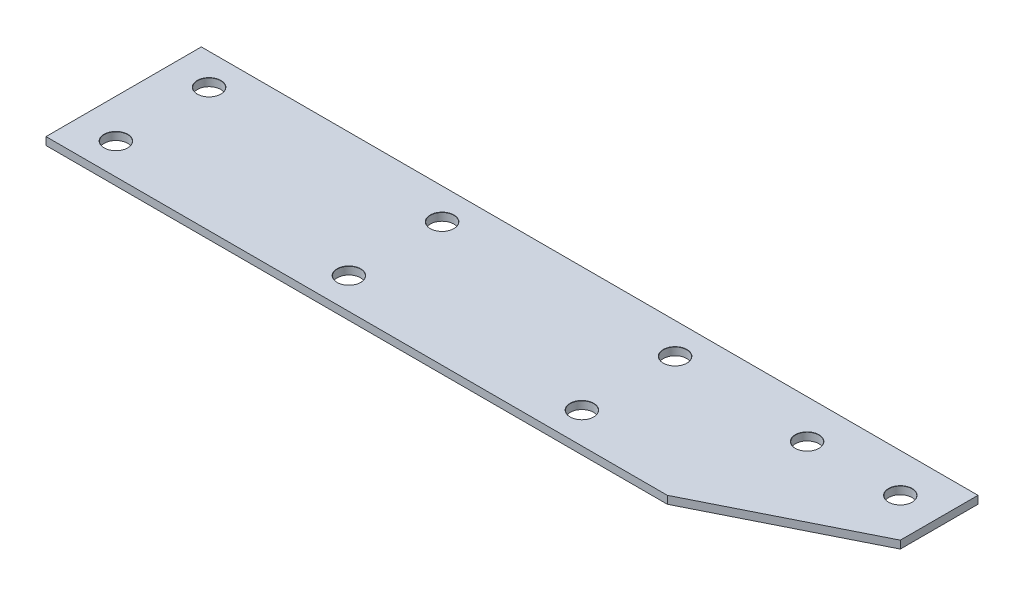
ISO-10303-21;
HEADER;
FILE_DESCRIPTION(('STEP AP214'),'2;1');
FILE_NAME('part.step','',(''),(''),'','','');
FILE_SCHEMA(('AUTOMOTIVE_DESIGN { 1 0 10303 214 1 1 1 1 }'));
ENDSEC;
DATA;
#1=APPLICATION_CONTEXT('core data for automotive mechanical design processes');
#2=APPLICATION_PROTOCOL_DEFINITION('international standard','automotive_design',2000,#1);
#3=PRODUCT_CONTEXT('',#1,'mechanical');
#4=PRODUCT('Part','Part','',(#3));
#5=PRODUCT_RELATED_PRODUCT_CATEGORY('part','',(#4));
#6=PRODUCT_DEFINITION_FORMATION('','',#4);
#7=PRODUCT_DEFINITION_CONTEXT('part definition',#1,'design');
#8=PRODUCT_DEFINITION('design','',#6,#7);
#9=PRODUCT_DEFINITION_SHAPE('','',#8);
#10=(LENGTH_UNIT() NAMED_UNIT(*) SI_UNIT(.MILLI.,.METRE.));
#11=(NAMED_UNIT(*) PLANE_ANGLE_UNIT() SI_UNIT($,.RADIAN.));
#12=(NAMED_UNIT(*) SI_UNIT($,.STERADIAN.) SOLID_ANGLE_UNIT());
#13=UNCERTAINTY_MEASURE_WITH_UNIT(LENGTH_MEASURE(1.E-05),#10,'distance_accuracy_value','');
#14=(GEOMETRIC_REPRESENTATION_CONTEXT(3) GLOBAL_UNCERTAINTY_ASSIGNED_CONTEXT((#13)) GLOBAL_UNIT_ASSIGNED_CONTEXT((#10,
#11,#12)) REPRESENTATION_CONTEXT('',''));
#15=CARTESIAN_POINT('',(0.,0.,0.));
#16=DIRECTION('',(0.,0.,1.));
#17=DIRECTION('',(1.,0.,0.));
#18=AXIS2_PLACEMENT_3D('',#15,#16,#17);
#19=CARTESIAN_POINT('',(0.,1.,0.));
#20=DIRECTION('',(-1.,0.,0.));
#21=DIRECTION('',(0.,0.,1.));
#22=AXIS2_PLACEMENT_3D('',#19,#20,#21);
#23=PLANE('',#22);
#24=DIRECTION('',(0.,0.,-1.));
#25=VECTOR('',#24,1.);
#26=CARTESIAN_POINT('',(0.,0.,0.));
#27=LINE('',#26,#25);
#28=CARTESIAN_POINT('',(0.,0.,0.));
#29=VERTEX_POINT('',#28);
#30=CARTESIAN_POINT('',(0.,0.,-20.));
#31=VERTEX_POINT('',#30);
#32=EDGE_CURVE('E132',#29,#31,#27,.T.);
#33=ORIENTED_EDGE('',*,*,#32,.F.);
#34=DIRECTION('',(0.,-1.,0.));
#35=VECTOR('',#34,1.);
#36=CARTESIAN_POINT('',(0.,1.,0.));
#37=LINE('',#36,#35);
#38=CARTESIAN_POINT('',(0.,1.,0.));
#39=VERTEX_POINT('',#38);
#40=EDGE_CURVE('E13',#39,#29,#37,.T.);
#41=ORIENTED_EDGE('',*,*,#40,.F.);
#42=DIRECTION('',(0.,0.,-1.));
#43=VECTOR('',#42,1.);
#44=CARTESIAN_POINT('',(0.,1.,0.));
#45=LINE('',#44,#43);
#46=CARTESIAN_POINT('',(0.,1.,-20.));
#47=VERTEX_POINT('',#46);
#48=EDGE_CURVE('E148',#39,#47,#45,.T.);
#49=ORIENTED_EDGE('',*,*,#48,.T.);
#50=DIRECTION('',(0.,-1.,0.));
#51=VECTOR('',#50,1.);
#52=CARTESIAN_POINT('',(0.,1.,-20.));
#53=LINE('',#52,#51);
#54=EDGE_CURVE('E53',#47,#31,#53,.T.);
#55=ORIENTED_EDGE('',*,*,#54,.T.);
#56=EDGE_LOOP('',(#33,#41,#49,#55));
#57=FACE_BOUND('',#56,.T.);
#58=ADVANCED_FACE('F50',(#57),#23,.T.);
#59=CARTESIAN_POINT('',(0.,1.,0.));
#60=DIRECTION('',(0.,0.,-1.));
#61=DIRECTION('',(-1.,0.,0.));
#62=AXIS2_PLACEMENT_3D('',#59,#60,#61);
#63=PLANE('',#62);
#64=DIRECTION('',(1.,0.,0.));
#65=VECTOR('',#64,1.);
#66=CARTESIAN_POINT('',(0.,0.,0.));
#67=LINE('',#66,#65);
#68=CARTESIAN_POINT('',(80.,0.,0.));
#69=VERTEX_POINT('',#68);
#70=EDGE_CURVE('E146',#29,#69,#67,.T.);
#71=ORIENTED_EDGE('',*,*,#70,.T.);
#72=DIRECTION('',(0.,-1.,0.));
#73=VECTOR('',#72,1.);
#74=CARTESIAN_POINT('',(80.,1.,0.));
#75=LINE('',#74,#73);
#76=CARTESIAN_POINT('',(80.,1.,0.));
#77=VERTEX_POINT('',#76);
#78=EDGE_CURVE('E60',#77,#69,#75,.T.);
#79=ORIENTED_EDGE('',*,*,#78,.F.);
#80=DIRECTION('',(1.,0.,0.));
#81=VECTOR('',#80,1.);
#82=CARTESIAN_POINT('',(0.,1.,0.));
#83=LINE('',#82,#81);
#84=EDGE_CURVE('E124',#39,#77,#83,.T.);
#85=ORIENTED_EDGE('',*,*,#84,.F.);
#86=ORIENTED_EDGE('',*,*,#40,.T.);
#87=EDGE_LOOP('',(#71,#79,#85,#86));
#88=FACE_BOUND('',#87,.T.);
#89=ADVANCED_FACE('F158',(#88),#63,.F.);
#90=CARTESIAN_POINT('',(100.,1.,-10.));
#91=DIRECTION('',(0.447213595499958,0.,0.894427190999916));
#92=DIRECTION('',(0.894427190999916,0.,-0.447213595499958));
#93=AXIS2_PLACEMENT_3D('',#90,#91,#92);
#94=PLANE('',#93);
#95=DIRECTION('',(-0.894427190999916,0.,0.447213595499958));
#96=VECTOR('',#95,1.);
#97=CARTESIAN_POINT('',(100.,0.,-10.));
#98=LINE('',#97,#96);
#99=CARTESIAN_POINT('',(100.,0.,-10.));
#100=VERTEX_POINT('',#99);
#101=EDGE_CURVE('E108',#100,#69,#98,.T.);
#102=ORIENTED_EDGE('',*,*,#101,.F.);
#103=DIRECTION('',(0.,-1.,0.));
#104=VECTOR('',#103,1.);
#105=CARTESIAN_POINT('',(100.,1.,-10.));
#106=LINE('',#105,#104);
#107=CARTESIAN_POINT('',(100.,1.,-10.));
#108=VERTEX_POINT('',#107);
#109=EDGE_CURVE('E102',#108,#100,#106,.T.);
#110=ORIENTED_EDGE('',*,*,#109,.F.);
#111=DIRECTION('',(-0.894427190999916,0.,0.447213595499958));
#112=VECTOR('',#111,1.);
#113=CARTESIAN_POINT('',(100.,1.,-10.));
#114=LINE('',#113,#112);
#115=EDGE_CURVE('E106',#108,#77,#114,.T.);
#116=ORIENTED_EDGE('',*,*,#115,.T.);
#117=ORIENTED_EDGE('',*,*,#78,.T.);
#118=EDGE_LOOP('',(#102,#110,#116,#117));
#119=FACE_BOUND('',#118,.T.);
#120=ADVANCED_FACE('F104',(#119),#94,.T.);
#121=CARTESIAN_POINT('',(100.,1.,-10.));
#122=DIRECTION('',(-1.,0.,0.));
#123=DIRECTION('',(0.,0.,1.));
#124=AXIS2_PLACEMENT_3D('',#121,#122,#123);
#125=PLANE('',#124);
#126=DIRECTION('',(0.,0.,-1.));
#127=VECTOR('',#126,1.);
#128=CARTESIAN_POINT('',(100.,0.,-10.));
#129=LINE('',#128,#127);
#130=CARTESIAN_POINT('',(100.,0.,-20.));
#131=VERTEX_POINT('',#130);
#132=EDGE_CURVE('E141',#100,#131,#129,.T.);
#133=ORIENTED_EDGE('',*,*,#132,.T.);
#134=DIRECTION('',(0.,-1.,0.));
#135=VECTOR('',#134,1.);
#136=CARTESIAN_POINT('',(100.,1.,-20.));
#137=LINE('',#136,#135);
#138=CARTESIAN_POINT('',(100.,1.,-20.));
#139=VERTEX_POINT('',#138);
#140=EDGE_CURVE('E113',#139,#131,#137,.T.);
#141=ORIENTED_EDGE('',*,*,#140,.F.);
#142=DIRECTION('',(0.,0.,-1.));
#143=VECTOR('',#142,1.);
#144=CARTESIAN_POINT('',(100.,1.,-10.));
#145=LINE('',#144,#143);
#146=EDGE_CURVE('E116',#108,#139,#145,.T.);
#147=ORIENTED_EDGE('',*,*,#146,.F.);
#148=ORIENTED_EDGE('',*,*,#109,.T.);
#149=EDGE_LOOP('',(#133,#141,#147,#148));
#150=FACE_BOUND('',#149,.T.);
#151=ADVANCED_FACE('F117',(#150),#125,.F.);
#152=CARTESIAN_POINT('',(0.,1.,-20.));
#153=DIRECTION('',(0.,0.,-1.));
#154=DIRECTION('',(-1.,0.,0.));
#155=AXIS2_PLACEMENT_3D('',#152,#153,#154);
#156=PLANE('',#155);
#157=DIRECTION('',(1.,0.,0.));
#158=VECTOR('',#157,1.);
#159=CARTESIAN_POINT('',(0.,0.,-20.));
#160=LINE('',#159,#158);
#161=EDGE_CURVE('E136',#31,#131,#160,.T.);
#162=ORIENTED_EDGE('',*,*,#161,.F.);
#163=ORIENTED_EDGE('',*,*,#54,.F.);
#164=DIRECTION('',(1.,0.,0.));
#165=VECTOR('',#164,1.);
#166=CARTESIAN_POINT('',(0.,1.,-20.));
#167=LINE('',#166,#165);
#168=EDGE_CURVE('E120',#47,#139,#167,.T.);
#169=ORIENTED_EDGE('',*,*,#168,.T.);
#170=ORIENTED_EDGE('',*,*,#140,.T.);
#171=EDGE_LOOP('',(#162,#163,#169,#170));
#172=FACE_BOUND('',#171,.T.);
#173=ADVANCED_FACE('F155',(#172),#156,.T.);
#174=CARTESIAN_POINT('',(0.,1.,0.));
#175=DIRECTION('',(0.,-1.,0.));
#176=DIRECTION('',(0.,0.,-1.));
#177=AXIS2_PLACEMENT_3D('',#174,#175,#176);
#178=PLANE('',#177);
#179=CARTESIAN_POINT('',(5.,1.,-16.));
#180=DIRECTION('',(0.,1.,0.));
#181=DIRECTION('',(0.,0.,1.));
#182=AXIS2_PLACEMENT_3D('',#179,#180,#181);
#183=CIRCLE('',#182,1.525);
#184=CARTESIAN_POINT('',(5.,1.,-14.475));
#185=VERTEX_POINT('',#184);
#186=EDGE_CURVE('E255',#185,#185,#183,.T.);
#187=ORIENTED_EDGE('',*,*,#186,.F.);
#188=EDGE_LOOP('',(#187));
#189=FACE_BOUND('',#188,.T.);
#190=CARTESIAN_POINT('',(5.,1.,-4.));
#191=DIRECTION('',(0.,1.,0.));
#192=DIRECTION('',(0.,0.,1.));
#193=AXIS2_PLACEMENT_3D('',#190,#191,#192);
#194=CIRCLE('',#193,1.525);
#195=CARTESIAN_POINT('',(5.,1.,-2.475));
#196=VERTEX_POINT('',#195);
#197=EDGE_CURVE('E243',#196,#196,#194,.T.);
#198=ORIENTED_EDGE('',*,*,#197,.F.);
#199=EDGE_LOOP('',(#198));
#200=FACE_BOUND('',#199,.T.);
#201=CARTESIAN_POINT('',(35.,1.,-16.));
#202=DIRECTION('',(0.,1.,0.));
#203=DIRECTION('',(0.,0.,1.));
#204=AXIS2_PLACEMENT_3D('',#201,#202,#203);
#205=CIRCLE('',#204,1.525);
#206=CARTESIAN_POINT('',(35.,1.,-14.475));
#207=VERTEX_POINT('',#206);
#208=EDGE_CURVE('E231',#207,#207,#205,.T.);
#209=ORIENTED_EDGE('',*,*,#208,.F.);
#210=EDGE_LOOP('',(#209));
#211=FACE_BOUND('',#210,.T.);
#212=CARTESIAN_POINT('',(65.,1.,-16.));
#213=DIRECTION('',(0.,1.,0.));
#214=DIRECTION('',(0.,0.,1.));
#215=AXIS2_PLACEMENT_3D('',#212,#213,#214);
#216=CIRCLE('',#215,1.525);
#217=CARTESIAN_POINT('',(65.,1.,-14.475));
#218=VERTEX_POINT('',#217);
#219=EDGE_CURVE('E219',#218,#218,#216,.T.);
#220=ORIENTED_EDGE('',*,*,#219,.F.);
#221=EDGE_LOOP('',(#220));
#222=FACE_BOUND('',#221,.T.);
#223=CARTESIAN_POINT('',(35.,1.,-4.));
#224=DIRECTION('',(0.,1.,0.));
#225=DIRECTION('',(0.,0.,1.));
#226=AXIS2_PLACEMENT_3D('',#223,#224,#225);
#227=CIRCLE('',#226,1.525);
#228=CARTESIAN_POINT('',(35.,1.,-2.475));
#229=VERTEX_POINT('',#228);
#230=EDGE_CURVE('E207',#229,#229,#227,.T.);
#231=ORIENTED_EDGE('',*,*,#230,.F.);
#232=EDGE_LOOP('',(#231));
#233=FACE_BOUND('',#232,.T.);
#234=CARTESIAN_POINT('',(65.,1.,-4.));
#235=DIRECTION('',(0.,1.,0.));
#236=DIRECTION('',(0.,0.,1.));
#237=AXIS2_PLACEMENT_3D('',#234,#235,#236);
#238=CIRCLE('',#237,1.525);
#239=CARTESIAN_POINT('',(65.,1.,-2.475));
#240=VERTEX_POINT('',#239);
#241=EDGE_CURVE('E195',#240,#240,#238,.T.);
#242=ORIENTED_EDGE('',*,*,#241,.F.);
#243=EDGE_LOOP('',(#242));
#244=FACE_BOUND('',#243,.T.);
#245=CARTESIAN_POINT('',(83.,1.,-15.));
#246=DIRECTION('',(0.,1.,0.));
#247=DIRECTION('',(0.,0.,1.));
#248=AXIS2_PLACEMENT_3D('',#245,#246,#247);
#249=CIRCLE('',#248,1.525);
#250=CARTESIAN_POINT('',(83.,1.,-13.475));
#251=VERTEX_POINT('',#250);
#252=EDGE_CURVE('E183',#251,#251,#249,.T.);
#253=ORIENTED_EDGE('',*,*,#252,.F.);
#254=EDGE_LOOP('',(#253));
#255=FACE_BOUND('',#254,.T.);
#256=CARTESIAN_POINT('',(95.,1.,-15.));
#257=DIRECTION('',(0.,1.,0.));
#258=DIRECTION('',(0.,0.,1.));
#259=AXIS2_PLACEMENT_3D('',#256,#257,#258);
#260=CIRCLE('',#259,1.525);
#261=CARTESIAN_POINT('',(95.,1.,-13.475));
#262=VERTEX_POINT('',#261);
#263=EDGE_CURVE('E171',#262,#262,#260,.T.);
#264=ORIENTED_EDGE('',*,*,#263,.F.);
#265=EDGE_LOOP('',(#264));
#266=FACE_BOUND('',#265,.T.);
#267=ORIENTED_EDGE('',*,*,#48,.F.);
#268=ORIENTED_EDGE('',*,*,#84,.T.);
#269=ORIENTED_EDGE('',*,*,#115,.F.);
#270=ORIENTED_EDGE('',*,*,#146,.T.);
#271=ORIENTED_EDGE('',*,*,#168,.F.);
#272=EDGE_LOOP('',(#267,#268,#269,#270,#271));
#273=FACE_BOUND('',#272,.T.);
#274=ADVANCED_FACE('F123',(#189,#200,#211,#222,#233,#244,#255,#266,#273),#178,.F.);
#275=CARTESIAN_POINT('',(0.,0.,0.));
#276=DIRECTION('',(0.,-1.,0.));
#277=DIRECTION('',(0.,0.,-1.));
#278=AXIS2_PLACEMENT_3D('',#275,#276,#277);
#279=PLANE('',#278);
#280=CARTESIAN_POINT('',(5.,0.,-16.));
#281=DIRECTION('',(0.,1.,0.));
#282=DIRECTION('',(0.,0.,1.));
#283=AXIS2_PLACEMENT_3D('',#280,#281,#282);
#284=CIRCLE('',#283,1.5);
#285=CARTESIAN_POINT('',(5.,0.,-14.5));
#286=VERTEX_POINT('',#285);
#287=EDGE_CURVE('E247',#286,#286,#284,.T.);
#288=ORIENTED_EDGE('',*,*,#287,.T.);
#289=EDGE_LOOP('',(#288));
#290=FACE_BOUND('',#289,.T.);
#291=CARTESIAN_POINT('',(5.,0.,-4.));
#292=DIRECTION('',(0.,1.,0.));
#293=DIRECTION('',(0.,0.,1.));
#294=AXIS2_PLACEMENT_3D('',#291,#292,#293);
#295=CIRCLE('',#294,1.5);
#296=CARTESIAN_POINT('',(5.,0.,-2.5));
#297=VERTEX_POINT('',#296);
#298=EDGE_CURVE('E235',#297,#297,#295,.T.);
#299=ORIENTED_EDGE('',*,*,#298,.T.);
#300=EDGE_LOOP('',(#299));
#301=FACE_BOUND('',#300,.T.);
#302=CARTESIAN_POINT('',(35.,0.,-16.));
#303=DIRECTION('',(0.,1.,0.));
#304=DIRECTION('',(0.,0.,1.));
#305=AXIS2_PLACEMENT_3D('',#302,#303,#304);
#306=CIRCLE('',#305,1.5);
#307=CARTESIAN_POINT('',(35.,0.,-14.5));
#308=VERTEX_POINT('',#307);
#309=EDGE_CURVE('E223',#308,#308,#306,.T.);
#310=ORIENTED_EDGE('',*,*,#309,.T.);
#311=EDGE_LOOP('',(#310));
#312=FACE_BOUND('',#311,.T.);
#313=CARTESIAN_POINT('',(65.,0.,-16.));
#314=DIRECTION('',(0.,1.,0.));
#315=DIRECTION('',(0.,0.,1.));
#316=AXIS2_PLACEMENT_3D('',#313,#314,#315);
#317=CIRCLE('',#316,1.5);
#318=CARTESIAN_POINT('',(65.,0.,-14.5));
#319=VERTEX_POINT('',#318);
#320=EDGE_CURVE('E211',#319,#319,#317,.T.);
#321=ORIENTED_EDGE('',*,*,#320,.T.);
#322=EDGE_LOOP('',(#321));
#323=FACE_BOUND('',#322,.T.);
#324=CARTESIAN_POINT('',(35.,0.,-4.));
#325=DIRECTION('',(0.,1.,0.));
#326=DIRECTION('',(0.,0.,1.));
#327=AXIS2_PLACEMENT_3D('',#324,#325,#326);
#328=CIRCLE('',#327,1.5);
#329=CARTESIAN_POINT('',(35.,0.,-2.5));
#330=VERTEX_POINT('',#329);
#331=EDGE_CURVE('E199',#330,#330,#328,.T.);
#332=ORIENTED_EDGE('',*,*,#331,.T.);
#333=EDGE_LOOP('',(#332));
#334=FACE_BOUND('',#333,.T.);
#335=CARTESIAN_POINT('',(65.,0.,-4.));
#336=DIRECTION('',(0.,1.,0.));
#337=DIRECTION('',(0.,0.,1.));
#338=AXIS2_PLACEMENT_3D('',#335,#336,#337);
#339=CIRCLE('',#338,1.5);
#340=CARTESIAN_POINT('',(65.,0.,-2.5));
#341=VERTEX_POINT('',#340);
#342=EDGE_CURVE('E187',#341,#341,#339,.T.);
#343=ORIENTED_EDGE('',*,*,#342,.T.);
#344=EDGE_LOOP('',(#343));
#345=FACE_BOUND('',#344,.T.);
#346=CARTESIAN_POINT('',(83.,0.,-15.));
#347=DIRECTION('',(0.,1.,0.));
#348=DIRECTION('',(0.,0.,1.));
#349=AXIS2_PLACEMENT_3D('',#346,#347,#348);
#350=CIRCLE('',#349,1.5);
#351=CARTESIAN_POINT('',(83.,0.,-13.5));
#352=VERTEX_POINT('',#351);
#353=EDGE_CURVE('E175',#352,#352,#350,.T.);
#354=ORIENTED_EDGE('',*,*,#353,.T.);
#355=EDGE_LOOP('',(#354));
#356=FACE_BOUND('',#355,.T.);
#357=CARTESIAN_POINT('',(95.,0.,-15.));
#358=DIRECTION('',(0.,1.,0.));
#359=DIRECTION('',(0.,0.,1.));
#360=AXIS2_PLACEMENT_3D('',#357,#358,#359);
#361=CIRCLE('',#360,1.5);
#362=CARTESIAN_POINT('',(95.,0.,-13.5));
#363=VERTEX_POINT('',#362);
#364=EDGE_CURVE('E137',#363,#363,#361,.T.);
#365=ORIENTED_EDGE('',*,*,#364,.T.);
#366=EDGE_LOOP('',(#365));
#367=FACE_BOUND('',#366,.T.);
#368=ORIENTED_EDGE('',*,*,#32,.T.);
#369=ORIENTED_EDGE('',*,*,#161,.T.);
#370=ORIENTED_EDGE('',*,*,#132,.F.);
#371=ORIENTED_EDGE('',*,*,#101,.T.);
#372=ORIENTED_EDGE('',*,*,#70,.F.);
#373=EDGE_LOOP('',(#368,#369,#370,#371,#372));
#374=FACE_BOUND('',#373,.T.);
#375=ADVANCED_FACE('F157',(#290,#301,#312,#323,#334,#345,#356,#367,#374),#279,.T.);
#376=CARTESIAN_POINT('',(95.,1.,-15.));
#377=DIRECTION('',(0.,1.,0.));
#378=DIRECTION('',(0.,0.,1.));
#379=AXIS2_PLACEMENT_3D('',#376,#377,#378);
#380=CYLINDRICAL_SURFACE('',#379,1.49999999999999);
#381=ORIENTED_EDGE('',*,*,#364,.F.);
#382=EDGE_LOOP('',(#381));
#383=FACE_BOUND('',#382,.T.);
#384=CARTESIAN_POINT('',(95.,0.975000000000003,-15.));
#385=DIRECTION('',(0.,1.,0.));
#386=DIRECTION('',(0.,0.,1.));
#387=AXIS2_PLACEMENT_3D('',#384,#385,#386);
#388=CIRCLE('',#387,1.49999999999999);
#389=CARTESIAN_POINT('',(95.,0.975000000000003,-13.5));
#390=VERTEX_POINT('',#389);
#391=EDGE_CURVE('E167',#390,#390,#388,.T.);
#392=ORIENTED_EDGE('',*,*,#391,.T.);
#393=EDGE_LOOP('',(#392));
#394=FACE_BOUND('',#393,.T.);
#395=ADVANCED_FACE('F283',(#383,#394),#380,.F.);
#396=CARTESIAN_POINT('',(95.,1.,-15.));
#397=DIRECTION('',(0.,1.,0.));
#398=DIRECTION('',(0.,0.,1.));
#399=AXIS2_PLACEMENT_3D('',#396,#397,#398);
#400=CONICAL_SURFACE('',#399,1.525,0.785398163397691);
#401=ORIENTED_EDGE('',*,*,#391,.F.);
#402=EDGE_LOOP('',(#401));
#403=FACE_BOUND('',#402,.T.);
#404=ORIENTED_EDGE('',*,*,#263,.T.);
#405=EDGE_LOOP('',(#404));
#406=FACE_BOUND('',#405,.T.);
#407=ADVANCED_FACE('F280',(#403,#406),#400,.F.);
#408=CARTESIAN_POINT('',(83.,1.,-15.));
#409=DIRECTION('',(0.,1.,0.));
#410=DIRECTION('',(0.,0.,1.));
#411=AXIS2_PLACEMENT_3D('',#408,#409,#410);
#412=CYLINDRICAL_SURFACE('',#411,1.49999999999999);
#413=ORIENTED_EDGE('',*,*,#353,.F.);
#414=EDGE_LOOP('',(#413));
#415=FACE_BOUND('',#414,.T.);
#416=CARTESIAN_POINT('',(83.,0.975000000000003,-15.));
#417=DIRECTION('',(0.,1.,0.));
#418=DIRECTION('',(0.,0.,1.));
#419=AXIS2_PLACEMENT_3D('',#416,#417,#418);
#420=CIRCLE('',#419,1.49999999999999);
#421=CARTESIAN_POINT('',(83.,0.975000000000003,-13.5));
#422=VERTEX_POINT('',#421);
#423=EDGE_CURVE('E179',#422,#422,#420,.T.);
#424=ORIENTED_EDGE('',*,*,#423,.T.);
#425=EDGE_LOOP('',(#424));
#426=FACE_BOUND('',#425,.T.);
#427=ADVANCED_FACE('F282',(#415,#426),#412,.F.);
#428=CARTESIAN_POINT('',(83.,1.,-15.));
#429=DIRECTION('',(0.,1.,0.));
#430=DIRECTION('',(0.,0.,1.));
#431=AXIS2_PLACEMENT_3D('',#428,#429,#430);
#432=CONICAL_SURFACE('',#431,1.525,0.785398163397691);
#433=ORIENTED_EDGE('',*,*,#423,.F.);
#434=EDGE_LOOP('',(#433));
#435=FACE_BOUND('',#434,.T.);
#436=ORIENTED_EDGE('',*,*,#252,.T.);
#437=EDGE_LOOP('',(#436));
#438=FACE_BOUND('',#437,.T.);
#439=ADVANCED_FACE('F290',(#435,#438),#432,.F.);
#440=CARTESIAN_POINT('',(65.,1.,-4.));
#441=DIRECTION('',(0.,1.,0.));
#442=DIRECTION('',(0.,0.,1.));
#443=AXIS2_PLACEMENT_3D('',#440,#441,#442);
#444=CYLINDRICAL_SURFACE('',#443,1.49999999999999);
#445=ORIENTED_EDGE('',*,*,#342,.F.);
#446=EDGE_LOOP('',(#445));
#447=FACE_BOUND('',#446,.T.);
#448=CARTESIAN_POINT('',(65.,0.975000000000003,-4.));
#449=DIRECTION('',(0.,1.,0.));
#450=DIRECTION('',(0.,0.,1.));
#451=AXIS2_PLACEMENT_3D('',#448,#449,#450);
#452=CIRCLE('',#451,1.49999999999999);
#453=CARTESIAN_POINT('',(65.,0.975000000000003,-2.50000000000001));
#454=VERTEX_POINT('',#453);
#455=EDGE_CURVE('E191',#454,#454,#452,.T.);
#456=ORIENTED_EDGE('',*,*,#455,.T.);
#457=EDGE_LOOP('',(#456));
#458=FACE_BOUND('',#457,.T.);
#459=ADVANCED_FACE('F346',(#447,#458),#444,.F.);
#460=CARTESIAN_POINT('',(65.,1.,-4.));
#461=DIRECTION('',(0.,1.,0.));
#462=DIRECTION('',(0.,0.,1.));
#463=AXIS2_PLACEMENT_3D('',#460,#461,#462);
#464=CONICAL_SURFACE('',#463,1.525,0.785398163397691);
#465=ORIENTED_EDGE('',*,*,#455,.F.);
#466=EDGE_LOOP('',(#465));
#467=FACE_BOUND('',#466,.T.);
#468=ORIENTED_EDGE('',*,*,#241,.T.);
#469=EDGE_LOOP('',(#468));
#470=FACE_BOUND('',#469,.T.);
#471=ADVANCED_FACE('F356',(#467,#470),#464,.F.);
#472=CARTESIAN_POINT('',(35.,1.,-4.));
#473=DIRECTION('',(0.,1.,0.));
#474=DIRECTION('',(0.,0.,1.));
#475=AXIS2_PLACEMENT_3D('',#472,#473,#474);
#476=CYLINDRICAL_SURFACE('',#475,1.49999999999999);
#477=ORIENTED_EDGE('',*,*,#331,.F.);
#478=EDGE_LOOP('',(#477));
#479=FACE_BOUND('',#478,.T.);
#480=CARTESIAN_POINT('',(35.,0.975000000000003,-4.));
#481=DIRECTION('',(0.,1.,0.));
#482=DIRECTION('',(0.,0.,1.));
#483=AXIS2_PLACEMENT_3D('',#480,#481,#482);
#484=CIRCLE('',#483,1.49999999999999);
#485=CARTESIAN_POINT('',(35.,0.975000000000003,-2.50000000000001));
#486=VERTEX_POINT('',#485);
#487=EDGE_CURVE('E203',#486,#486,#484,.T.);
#488=ORIENTED_EDGE('',*,*,#487,.T.);
#489=EDGE_LOOP('',(#488));
#490=FACE_BOUND('',#489,.T.);
#491=ADVANCED_FACE('F366',(#479,#490),#476,.F.);
#492=CARTESIAN_POINT('',(35.,1.,-4.));
#493=DIRECTION('',(0.,1.,0.));
#494=DIRECTION('',(0.,0.,1.));
#495=AXIS2_PLACEMENT_3D('',#492,#493,#494);
#496=CONICAL_SURFACE('',#495,1.525,0.785398163397691);
#497=ORIENTED_EDGE('',*,*,#487,.F.);
#498=EDGE_LOOP('',(#497));
#499=FACE_BOUND('',#498,.T.);
#500=ORIENTED_EDGE('',*,*,#230,.T.);
#501=EDGE_LOOP('',(#500));
#502=FACE_BOUND('',#501,.T.);
#503=ADVANCED_FACE('F376',(#499,#502),#496,.F.);
#504=CARTESIAN_POINT('',(65.,1.,-16.));
#505=DIRECTION('',(0.,1.,0.));
#506=DIRECTION('',(0.,0.,1.));
#507=AXIS2_PLACEMENT_3D('',#504,#505,#506);
#508=CYLINDRICAL_SURFACE('',#507,1.49999999999999);
#509=ORIENTED_EDGE('',*,*,#320,.F.);
#510=EDGE_LOOP('',(#509));
#511=FACE_BOUND('',#510,.T.);
#512=CARTESIAN_POINT('',(65.,0.975000000000003,-16.));
#513=DIRECTION('',(0.,1.,0.));
#514=DIRECTION('',(0.,0.,1.));
#515=AXIS2_PLACEMENT_3D('',#512,#513,#514);
#516=CIRCLE('',#515,1.49999999999999);
#517=CARTESIAN_POINT('',(65.,0.975000000000003,-14.5));
#518=VERTEX_POINT('',#517);
#519=EDGE_CURVE('E215',#518,#518,#516,.T.);
#520=ORIENTED_EDGE('',*,*,#519,.T.);
#521=EDGE_LOOP('',(#520));
#522=FACE_BOUND('',#521,.T.);
#523=ADVANCED_FACE('F386',(#511,#522),#508,.F.);
#524=CARTESIAN_POINT('',(65.,1.,-16.));
#525=DIRECTION('',(0.,1.,0.));
#526=DIRECTION('',(0.,0.,1.));
#527=AXIS2_PLACEMENT_3D('',#524,#525,#526);
#528=CONICAL_SURFACE('',#527,1.525,0.785398163397691);
#529=ORIENTED_EDGE('',*,*,#519,.F.);
#530=EDGE_LOOP('',(#529));
#531=FACE_BOUND('',#530,.T.);
#532=ORIENTED_EDGE('',*,*,#219,.T.);
#533=EDGE_LOOP('',(#532));
#534=FACE_BOUND('',#533,.T.);
#535=ADVANCED_FACE('F396',(#531,#534),#528,.F.);
#536=CARTESIAN_POINT('',(35.,1.,-16.));
#537=DIRECTION('',(0.,1.,0.));
#538=DIRECTION('',(0.,0.,1.));
#539=AXIS2_PLACEMENT_3D('',#536,#537,#538);
#540=CYLINDRICAL_SURFACE('',#539,1.49999999999999);
#541=ORIENTED_EDGE('',*,*,#309,.F.);
#542=EDGE_LOOP('',(#541));
#543=FACE_BOUND('',#542,.T.);
#544=CARTESIAN_POINT('',(35.,0.975000000000003,-16.));
#545=DIRECTION('',(0.,1.,0.));
#546=DIRECTION('',(0.,0.,1.));
#547=AXIS2_PLACEMENT_3D('',#544,#545,#546);
#548=CIRCLE('',#547,1.49999999999999);
#549=CARTESIAN_POINT('',(35.,0.975000000000003,-14.5));
#550=VERTEX_POINT('',#549);
#551=EDGE_CURVE('E227',#550,#550,#548,.T.);
#552=ORIENTED_EDGE('',*,*,#551,.T.);
#553=EDGE_LOOP('',(#552));
#554=FACE_BOUND('',#553,.T.);
#555=ADVANCED_FACE('F406',(#543,#554),#540,.F.);
#556=CARTESIAN_POINT('',(35.,1.,-16.));
#557=DIRECTION('',(0.,1.,0.));
#558=DIRECTION('',(0.,0.,1.));
#559=AXIS2_PLACEMENT_3D('',#556,#557,#558);
#560=CONICAL_SURFACE('',#559,1.525,0.785398163397691);
#561=ORIENTED_EDGE('',*,*,#551,.F.);
#562=EDGE_LOOP('',(#561));
#563=FACE_BOUND('',#562,.T.);
#564=ORIENTED_EDGE('',*,*,#208,.T.);
#565=EDGE_LOOP('',(#564));
#566=FACE_BOUND('',#565,.T.);
#567=ADVANCED_FACE('F416',(#563,#566),#560,.F.);
#568=CARTESIAN_POINT('',(5.,1.,-4.));
#569=DIRECTION('',(0.,1.,0.));
#570=DIRECTION('',(0.,0.,1.));
#571=AXIS2_PLACEMENT_3D('',#568,#569,#570);
#572=CYLINDRICAL_SURFACE('',#571,1.49999999999999);
#573=ORIENTED_EDGE('',*,*,#298,.F.);
#574=EDGE_LOOP('',(#573));
#575=FACE_BOUND('',#574,.T.);
#576=CARTESIAN_POINT('',(5.,0.975000000000003,-4.));
#577=DIRECTION('',(0.,1.,0.));
#578=DIRECTION('',(0.,0.,1.));
#579=AXIS2_PLACEMENT_3D('',#576,#577,#578);
#580=CIRCLE('',#579,1.49999999999999);
#581=CARTESIAN_POINT('',(5.,0.975000000000003,-2.50000000000001));
#582=VERTEX_POINT('',#581);
#583=EDGE_CURVE('E239',#582,#582,#580,.T.);
#584=ORIENTED_EDGE('',*,*,#583,.T.);
#585=EDGE_LOOP('',(#584));
#586=FACE_BOUND('',#585,.T.);
#587=ADVANCED_FACE('F426',(#575,#586),#572,.F.);
#588=CARTESIAN_POINT('',(5.,1.,-4.));
#589=DIRECTION('',(0.,1.,0.));
#590=DIRECTION('',(0.,0.,1.));
#591=AXIS2_PLACEMENT_3D('',#588,#589,#590);
#592=CONICAL_SURFACE('',#591,1.525,0.785398163397726);
#593=ORIENTED_EDGE('',*,*,#583,.F.);
#594=EDGE_LOOP('',(#593));
#595=FACE_BOUND('',#594,.T.);
#596=ORIENTED_EDGE('',*,*,#197,.T.);
#597=EDGE_LOOP('',(#596));
#598=FACE_BOUND('',#597,.T.);
#599=ADVANCED_FACE('F436',(#595,#598),#592,.F.);
#600=CARTESIAN_POINT('',(5.,1.,-16.));
#601=DIRECTION('',(0.,1.,0.));
#602=DIRECTION('',(0.,0.,1.));
#603=AXIS2_PLACEMENT_3D('',#600,#601,#602);
#604=CYLINDRICAL_SURFACE('',#603,1.49999999999999);
#605=ORIENTED_EDGE('',*,*,#287,.F.);
#606=EDGE_LOOP('',(#605));
#607=FACE_BOUND('',#606,.T.);
#608=CARTESIAN_POINT('',(5.,0.975000000000003,-16.));
#609=DIRECTION('',(0.,1.,0.));
#610=DIRECTION('',(0.,0.,1.));
#611=AXIS2_PLACEMENT_3D('',#608,#609,#610);
#612=CIRCLE('',#611,1.49999999999999);
#613=CARTESIAN_POINT('',(5.,0.975000000000003,-14.5));
#614=VERTEX_POINT('',#613);
#615=EDGE_CURVE('E251',#614,#614,#612,.T.);
#616=ORIENTED_EDGE('',*,*,#615,.T.);
#617=EDGE_LOOP('',(#616));
#618=FACE_BOUND('',#617,.T.);
#619=ADVANCED_FACE('F446',(#607,#618),#604,.F.);
#620=CARTESIAN_POINT('',(5.,1.,-16.));
#621=DIRECTION('',(0.,1.,0.));
#622=DIRECTION('',(0.,0.,1.));
#623=AXIS2_PLACEMENT_3D('',#620,#621,#622);
#624=CONICAL_SURFACE('',#623,1.525,0.785398163397726);
#625=ORIENTED_EDGE('',*,*,#615,.F.);
#626=EDGE_LOOP('',(#625));
#627=FACE_BOUND('',#626,.T.);
#628=ORIENTED_EDGE('',*,*,#186,.T.);
#629=EDGE_LOOP('',(#628));
#630=FACE_BOUND('',#629,.T.);
#631=ADVANCED_FACE('F261',(#627,#630),#624,.F.);
#632=CLOSED_SHELL('',(#58,#89,#120,#151,#173,#274,#375,#395,#407,#427,#439,#459,#471,#491,#503,
#523,#535,#555,#567,#587,#599,#619,#631));
#633=MANIFOLD_SOLID_BREP('B2',#632);
#634=ADVANCED_BREP_SHAPE_REPRESENTATION('',(#18,#633),#14);
#635=SHAPE_DEFINITION_REPRESENTATION(#9,#634);
ENDSEC;
END-ISO-10303-21;
